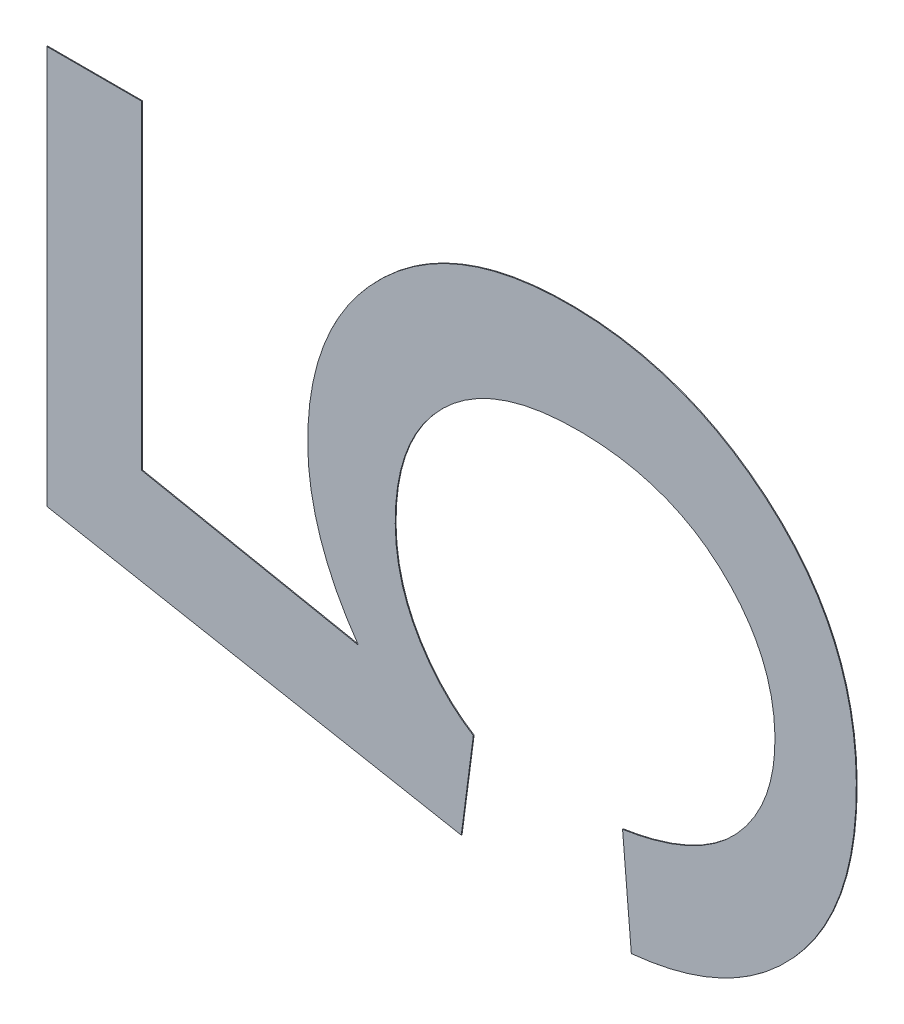
ISO-10303-21;
HEADER;
FILE_DESCRIPTION(('STEP AP214'),'2;1');
FILE_NAME('part.step','',(''),(''),'','','');
FILE_SCHEMA(('AUTOMOTIVE_DESIGN { 1 0 10303 214 1 1 1 1 }'));
ENDSEC;
DATA;
#1=APPLICATION_CONTEXT('core data for automotive mechanical design processes');
#2=APPLICATION_PROTOCOL_DEFINITION('international standard','automotive_design',2000,#1);
#3=PRODUCT_CONTEXT('',#1,'mechanical');
#4=PRODUCT('Part','Part','',(#3));
#5=PRODUCT_RELATED_PRODUCT_CATEGORY('part','',(#4));
#6=PRODUCT_DEFINITION_FORMATION('','',#4);
#7=PRODUCT_DEFINITION_CONTEXT('part definition',#1,'design');
#8=PRODUCT_DEFINITION('design','',#6,#7);
#9=PRODUCT_DEFINITION_SHAPE('','',#8);
#10=(LENGTH_UNIT() NAMED_UNIT(*) SI_UNIT(.MILLI.,.METRE.));
#11=(NAMED_UNIT(*) PLANE_ANGLE_UNIT() SI_UNIT($,.RADIAN.));
#12=(NAMED_UNIT(*) SI_UNIT($,.STERADIAN.) SOLID_ANGLE_UNIT());
#13=UNCERTAINTY_MEASURE_WITH_UNIT(LENGTH_MEASURE(1.E-05),#10,'distance_accuracy_value','');
#14=(GEOMETRIC_REPRESENTATION_CONTEXT(3) GLOBAL_UNCERTAINTY_ASSIGNED_CONTEXT((#13)) GLOBAL_UNIT_ASSIGNED_CONTEXT((#10,
#11,#12)) REPRESENTATION_CONTEXT('',''));
#15=CARTESIAN_POINT('',(0.,0.,0.));
#16=DIRECTION('',(0.,0.,1.));
#17=DIRECTION('',(1.,0.,0.));
#18=AXIS2_PLACEMENT_3D('',#15,#16,#17);
#19=CARTESIAN_POINT('',(63.4544710456313,-9.91477540411022,0.002));
#20=DIRECTION('',(0.996426205082625,0.0844678508347327,0.));
#21=DIRECTION('',(-0.0844678508347327,0.996426205082625,0.));
#22=AXIS2_PLACEMENT_3D('',#19,#20,#21);
#23=PLANE('',#22);
#24=CARTESIAN_POINT('',(63.4544710456313,-9.91477540411022,0.));
#25=CARTESIAN_POINT('',(63.4617011117932,-10.000064982536,0.));
#26=CARTESIAN_POINT('',(63.4689311779551,-10.0853545609618,0.));
#27=CARTESIAN_POINT('',(63.476161244117,-10.1706441393876,0.));
#28=B_SPLINE_CURVE_WITH_KNOTS('',3,(#24,#25,#26,#27),.UNSPECIFIED.,.F.,.F.,(4,4),(0.,
0.0271361239306038),.UNSPECIFIED.);
#29=CARTESIAN_POINT('',(63.4544710456313,-9.91477540411022,0.));
#30=VERTEX_POINT('',#29);
#31=CARTESIAN_POINT('',(63.476161244117,-10.1706441393876,0.));
#32=VERTEX_POINT('',#31);
#33=EDGE_CURVE('E96',#30,#32,#28,.T.);
#34=ORIENTED_EDGE('',*,*,#33,.T.);
#35=DIRECTION('',(0.,0.,-1.));
#36=VECTOR('',#35,1.);
#37=CARTESIAN_POINT('',(63.476161244117,-10.1706441393876,0.002));
#38=LINE('',#37,#36);
#39=CARTESIAN_POINT('',(63.476161244117,-10.1706441393876,0.002));
#40=VERTEX_POINT('',#39);
#41=EDGE_CURVE('E105',#40,#32,#38,.T.);
#42=ORIENTED_EDGE('',*,*,#41,.F.);
#43=CARTESIAN_POINT('',(63.4544710456313,-9.91477540411022,0.002));
#44=CARTESIAN_POINT('',(63.4617011117932,-10.000064982536,0.002));
#45=CARTESIAN_POINT('',(63.4689311779551,-10.0853545609618,0.002));
#46=CARTESIAN_POINT('',(63.476161244117,-10.1706441393876,0.002));
#47=B_SPLINE_CURVE_WITH_KNOTS('',3,(#43,#44,#45,#46),.UNSPECIFIED.,.F.,.F.,(4,4),(0.,
0.0271361239306038),.UNSPECIFIED.);
#48=CARTESIAN_POINT('',(63.4544710456313,-9.91477540411022,0.002));
#49=VERTEX_POINT('',#48);
#50=EDGE_CURVE('E110',#49,#40,#47,.T.);
#51=ORIENTED_EDGE('',*,*,#50,.F.);
#52=DIRECTION('',(0.,0.,-1.));
#53=VECTOR('',#52,1.);
#54=CARTESIAN_POINT('',(63.4544710456313,-9.91477540411022,0.002));
#55=LINE('',#54,#53);
#56=EDGE_CURVE('E102',#49,#30,#55,.T.);
#57=ORIENTED_EDGE('',*,*,#56,.T.);
#58=EDGE_LOOP('',(#34,#42,#51,#57));
#59=FACE_BOUND('',#58,.T.);
#60=ADVANCED_FACE('F17',(#59),#23,.F.);
#61=CARTESIAN_POINT('',(63.476161244117,-10.1706441393876,0.002));
#62=CARTESIAN_POINT('',(63.6443625946388,-10.1543985054017,0.002));
#63=CARTESIAN_POINT('',(63.7794147738899,-10.0890098286086,0.002));
#64=CARTESIAN_POINT('',(63.9832207898506,-9.86075867110722,0.002));
#65=CARTESIAN_POINT('',(64.0339676693268,-9.71332954268548,0.002));
#66=CARTESIAN_POINT('',(64.0339676693268,-9.31246852408422,0.002));
#67=CARTESIAN_POINT('',(63.9533456108042,-9.1390463812851,0.002));
#68=CARTESIAN_POINT('',(63.6589747764427,-8.90740387384396,0.002));
#69=CARTESIAN_POINT('',(63.5031716799673,-8.85434164568279,0.002));
#70=CARTESIAN_POINT('',(63.1319828115408,-8.85434164568279,0.002));
#71=CARTESIAN_POINT('',(62.9764681808881,-8.91404435058085,0.002));
#72=CARTESIAN_POINT('',(62.7341972884979,-9.15203843627509,0.002));
#73=CARTESIAN_POINT('',(62.6740331491713,-9.29865973519624,0.002));
#74=CARTESIAN_POINT('',(62.6740331491713,-9.60285923158159,0.002));
#75=CARTESIAN_POINT('',(62.7157765500307,-9.72795061327275,0.002));
#76=CARTESIAN_POINT('',(62.7996726007776,-9.84694988221923,0.002));
#77=B_SPLINE_CURVE_WITH_KNOTS('',3,(#61,#62,#63,#64,#65,#66,#67,#68,#69,#70,#71,#72,#73,#74,#75,
#76),.UNSPECIFIED.,.F.,.F.,(4,2,2,2,2,2,2,4),(0.0271361239306038,0.0758681975718254,
0.124600271213045,0.184198280193186,0.23285420515581,0.28381661866068,0.334777125474917,
0.373206360121718),.UNSPECIFIED.);
#78=DIRECTION('',(0.,0.,-1.));
#79=VECTOR('',#78,1.);
#80=SURFACE_OF_LINEAR_EXTRUSION('',#77,#79);
#81=CARTESIAN_POINT('',(63.476161244117,-10.1706441393876,0.));
#82=CARTESIAN_POINT('',(63.6443625946388,-10.1543985054017,0.));
#83=CARTESIAN_POINT('',(63.7794147738899,-10.0890098286086,0.));
#84=CARTESIAN_POINT('',(63.9832207898506,-9.86075867110722,0.));
#85=CARTESIAN_POINT('',(64.0339676693268,-9.71332954268548,0.));
#86=CARTESIAN_POINT('',(64.0339676693268,-9.31246852408422,0.));
#87=CARTESIAN_POINT('',(63.9533456108042,-9.1390463812851,0.));
#88=CARTESIAN_POINT('',(63.6589747764427,-8.90740387384396,0.));
#89=CARTESIAN_POINT('',(63.5031716799673,-8.85434164568279,0.));
#90=CARTESIAN_POINT('',(63.1319828115408,-8.85434164568279,0.));
#91=CARTESIAN_POINT('',(62.9764681808881,-8.91404435058085,0.));
#92=CARTESIAN_POINT('',(62.7341972884979,-9.15203843627509,0.));
#93=CARTESIAN_POINT('',(62.6740331491713,-9.29865973519624,0.));
#94=CARTESIAN_POINT('',(62.6740331491713,-9.60285923158159,0.));
#95=CARTESIAN_POINT('',(62.7157765500307,-9.72795061327275,0.));
#96=CARTESIAN_POINT('',(62.7996726007776,-9.84694988221923,0.));
#97=B_SPLINE_CURVE_WITH_KNOTS('',3,(#81,#82,#83,#84,#85,#86,#87,#88,#89,#90,#91,#92,#93,#94,#95,
#96),.UNSPECIFIED.,.F.,.F.,(4,2,2,2,2,2,2,4),(0.0271361239306038,0.0758681975718254,
0.124600271213045,0.184198280193186,0.23285420515581,0.28381661866068,0.334777125474917,
0.373206360121718),.UNSPECIFIED.);
#98=CARTESIAN_POINT('',(62.7996726007776,-9.84694988221923,0.));
#99=VERTEX_POINT('',#98);
#100=EDGE_CURVE('E93',#32,#99,#97,.T.);
#101=ORIENTED_EDGE('',*,*,#100,.T.);
#102=DIRECTION('',(0.,0.,-1.));
#103=VECTOR('',#102,1.);
#104=CARTESIAN_POINT('',(62.7996726007776,-9.84694988221923,0.002));
#105=LINE('',#104,#103);
#106=CARTESIAN_POINT('',(62.7996726007776,-9.84694988221923,0.002));
#107=VERTEX_POINT('',#106);
#108=EDGE_CURVE('E101',#107,#99,#105,.T.);
#109=ORIENTED_EDGE('',*,*,#108,.F.);
#110=EDGE_CURVE('E87',#40,#107,#77,.T.);
#111=ORIENTED_EDGE('',*,*,#110,.F.);
#112=ORIENTED_EDGE('',*,*,#41,.T.);
#113=EDGE_LOOP('',(#101,#109,#111,#112));
#114=FACE_BOUND('',#113,.T.);
#115=ADVANCED_FACE('F106',(#114),#80,.F.);
#116=CARTESIAN_POINT('',(62.7996726007776,-9.84694988221923,0.002));
#117=DIRECTION('',(-0.194825865837274,-0.980837846945537,0.));
#118=DIRECTION('',(0.980837846945537,-0.194825865837274,0.));
#119=AXIS2_PLACEMENT_3D('',#116,#117,#118);
#120=PLANE('',#119);
#121=CARTESIAN_POINT('',(62.7996726007776,-9.84694988221923,0.));
#122=CARTESIAN_POINT('',(62.6204215264989,-9.81134486773354,0.));
#123=CARTESIAN_POINT('',(62.4411704522202,-9.77573985324784,0.));
#124=CARTESIAN_POINT('',(62.2619193779415,-9.74013483876215,0.));
#125=B_SPLINE_CURVE_WITH_KNOTS('',3,(#121,#122,#123,#124),.UNSPECIFIED.,.F.,.F.,(4,4),
(0.373206360121718,0.428480337278279),.UNSPECIFIED.);
#126=CARTESIAN_POINT('',(62.2619193779415,-9.74013483876215,0.));
#127=VERTEX_POINT('',#126);
#128=EDGE_CURVE('E98',#99,#127,#125,.T.);
#129=ORIENTED_EDGE('',*,*,#128,.T.);
#130=DIRECTION('',(0.,0.,-1.));
#131=VECTOR('',#130,1.);
#132=CARTESIAN_POINT('',(62.2619193779415,-9.74013483876215,0.002));
#133=LINE('',#132,#131);
#134=CARTESIAN_POINT('',(62.2619193779415,-9.74013483876215,0.002));
#135=VERTEX_POINT('',#134);
#136=EDGE_CURVE('E353',#135,#127,#133,.T.);
#137=ORIENTED_EDGE('',*,*,#136,.F.);
#138=CARTESIAN_POINT('',(62.7996726007776,-9.84694988221923,0.002));
#139=CARTESIAN_POINT('',(62.6204215264989,-9.81134486773354,0.002));
#140=CARTESIAN_POINT('',(62.4411704522202,-9.77573985324784,0.002));
#141=CARTESIAN_POINT('',(62.2619193779415,-9.74013483876215,0.002));
#142=B_SPLINE_CURVE_WITH_KNOTS('',3,(#138,#139,#140,#141),.UNSPECIFIED.,.F.,.F.,(4,4),
(0.373206360121718,0.428480337278279),.UNSPECIFIED.);
#143=EDGE_CURVE('E346',#107,#135,#142,.T.);
#144=ORIENTED_EDGE('',*,*,#143,.F.);
#145=ORIENTED_EDGE('',*,*,#108,.T.);
#146=EDGE_LOOP('',(#129,#137,#144,#145));
#147=FACE_BOUND('',#146,.T.);
#148=ADVANCED_FACE('F161',(#147),#120,.F.);
#149=CARTESIAN_POINT('',(62.2619193779415,-9.74013483876215,0.002));
#150=DIRECTION('',(-1.,0.,0.));
#151=DIRECTION('',(0.,0.,1.));
#152=AXIS2_PLACEMENT_3D('',#149,#150,#151);
#153=PLANE('',#152);
#154=CARTESIAN_POINT('',(62.2619193779415,-9.74013483876215,0.));
#155=CARTESIAN_POINT('',(62.2619193779415,-9.47600790620861,0.));
#156=CARTESIAN_POINT('',(62.2619193779415,-9.21188097365507,0.));
#157=CARTESIAN_POINT('',(62.2619193779415,-8.94775404110152,0.));
#158=B_SPLINE_CURVE_WITH_KNOTS('',3,(#154,#155,#156,#157),.UNSPECIFIED.,.F.,.F.,(4,4),
(0.428480337278279,0.5083660015048),.UNSPECIFIED.);
#159=CARTESIAN_POINT('',(62.2619193779415,-8.94775404110152,0.));
#160=VERTEX_POINT('',#159);
#161=EDGE_CURVE('E342',#127,#160,#158,.T.);
#162=ORIENTED_EDGE('',*,*,#161,.T.);
#163=DIRECTION('',(0.,0.,-1.));
#164=VECTOR('',#163,1.);
#165=CARTESIAN_POINT('',(62.2619193779415,-8.94775404110152,0.002));
#166=LINE('',#165,#164);
#167=CARTESIAN_POINT('',(62.2619193779415,-8.94775404110152,0.002));
#168=VERTEX_POINT('',#167);
#169=EDGE_CURVE('E337',#168,#160,#166,.T.);
#170=ORIENTED_EDGE('',*,*,#169,.F.);
#171=CARTESIAN_POINT('',(62.2619193779415,-9.74013483876215,0.002));
#172=CARTESIAN_POINT('',(62.2619193779415,-9.47600790620861,0.002));
#173=CARTESIAN_POINT('',(62.2619193779415,-9.21188097365507,0.002));
#174=CARTESIAN_POINT('',(62.2619193779415,-8.94775404110152,0.002));
#175=B_SPLINE_CURVE_WITH_KNOTS('',3,(#171,#172,#173,#174),.UNSPECIFIED.,.F.,.F.,(4,4),
(0.428480337278279,0.5083660015048),.UNSPECIFIED.);
#176=EDGE_CURVE('E330',#135,#168,#175,.T.);
#177=ORIENTED_EDGE('',*,*,#176,.F.);
#178=ORIENTED_EDGE('',*,*,#136,.T.);
#179=EDGE_LOOP('',(#162,#170,#177,#178));
#180=FACE_BOUND('',#179,.T.);
#181=ADVANCED_FACE('F164',(#180),#153,.F.);
#182=CARTESIAN_POINT('',(62.2619193779415,-8.94775404110152,0.002));
#183=DIRECTION('',(0.,-1.,0.));
#184=DIRECTION('',(0.,0.,-1.));
#185=AXIS2_PLACEMENT_3D('',#182,#183,#184);
#186=PLANE('',#185);
#187=CARTESIAN_POINT('',(62.2619193779415,-8.94775404110152,0.));
#188=CARTESIAN_POINT('',(62.1837528135871,-8.94775404110152,0.));
#189=CARTESIAN_POINT('',(62.1055862492327,-8.94775404110152,0.));
#190=CARTESIAN_POINT('',(62.0274196848782,-8.94775404110152,0.));
#191=B_SPLINE_CURVE_WITH_KNOTS('',3,(#187,#188,#189,#190),.UNSPECIFIED.,.F.,.F.,(4,4),
(0.5083660015048,0.532007619011131),.UNSPECIFIED.);
#192=CARTESIAN_POINT('',(62.0274196848782,-8.94775404110152,0.));
#193=VERTEX_POINT('',#192);
#194=EDGE_CURVE('E326',#160,#193,#191,.T.);
#195=ORIENTED_EDGE('',*,*,#194,.T.);
#196=DIRECTION('',(0.,0.,-1.));
#197=VECTOR('',#196,1.);
#198=CARTESIAN_POINT('',(62.0274196848782,-8.94775404110152,0.002));
#199=LINE('',#198,#197);
#200=CARTESIAN_POINT('',(62.0274196848782,-8.94775404110152,0.002));
#201=VERTEX_POINT('',#200);
#202=EDGE_CURVE('E321',#201,#193,#199,.T.);
#203=ORIENTED_EDGE('',*,*,#202,.F.);
#204=CARTESIAN_POINT('',(62.2619193779415,-8.94775404110152,0.002));
#205=CARTESIAN_POINT('',(62.1837528135871,-8.94775404110152,0.002));
#206=CARTESIAN_POINT('',(62.1055862492327,-8.94775404110152,0.002));
#207=CARTESIAN_POINT('',(62.0274196848782,-8.94775404110152,0.002));
#208=B_SPLINE_CURVE_WITH_KNOTS('',3,(#204,#205,#206,#207),.UNSPECIFIED.,.F.,.F.,(4,4),
(0.5083660015048,0.532007619011131),.UNSPECIFIED.);
#209=EDGE_CURVE('E314',#168,#201,#208,.T.);
#210=ORIENTED_EDGE('',*,*,#209,.F.);
#211=ORIENTED_EDGE('',*,*,#169,.T.);
#212=EDGE_LOOP('',(#195,#203,#210,#211));
#213=FACE_BOUND('',#212,.T.);
#214=ADVANCED_FACE('F168',(#213),#186,.F.);
#215=CARTESIAN_POINT('',(62.0274196848782,-8.94775404110152,0.002));
#216=DIRECTION('',(1.,0.,0.));
#217=DIRECTION('',(0.,0.,-1.));
#218=AXIS2_PLACEMENT_3D('',#215,#216,#217);
#219=PLANE('',#218);
#220=CARTESIAN_POINT('',(62.0274196848782,-8.94775404110152,0.));
#221=CARTESIAN_POINT('',(62.0274196848782,-9.27686350959853,0.));
#222=CARTESIAN_POINT('',(62.0274196848782,-9.60597297809554,0.));
#223=CARTESIAN_POINT('',(62.0274196848782,-9.93508244659255,0.));
#224=B_SPLINE_CURVE_WITH_KNOTS('',3,(#220,#221,#222,#223),.UNSPECIFIED.,.F.,.F.,(4,4),
(0.532007619011131,0.63154736772032),.UNSPECIFIED.);
#225=CARTESIAN_POINT('',(62.0274196848782,-9.93508244659255,0.));
#226=VERTEX_POINT('',#225);
#227=EDGE_CURVE('E310',#193,#226,#224,.T.);
#228=ORIENTED_EDGE('',*,*,#227,.T.);
#229=DIRECTION('',(0.,0.,-1.));
#230=VECTOR('',#229,1.);
#231=CARTESIAN_POINT('',(62.0274196848782,-9.93508244659255,0.002));
#232=LINE('',#231,#230);
#233=CARTESIAN_POINT('',(62.0274196848782,-9.93508244659255,0.002));
#234=VERTEX_POINT('',#233);
#235=EDGE_CURVE('E305',#234,#226,#232,.T.);
#236=ORIENTED_EDGE('',*,*,#235,.F.);
#237=CARTESIAN_POINT('',(62.0274196848782,-8.94775404110152,0.002));
#238=CARTESIAN_POINT('',(62.0274196848782,-9.27686350959853,0.002));
#239=CARTESIAN_POINT('',(62.0274196848782,-9.60597297809554,0.002));
#240=CARTESIAN_POINT('',(62.0274196848782,-9.93508244659255,0.002));
#241=B_SPLINE_CURVE_WITH_KNOTS('',3,(#237,#238,#239,#240),.UNSPECIFIED.,.F.,.F.,(4,4),
(0.532007619011131,0.63154736772032),.UNSPECIFIED.);
#242=EDGE_CURVE('E298',#201,#234,#241,.T.);
#243=ORIENTED_EDGE('',*,*,#242,.F.);
#244=ORIENTED_EDGE('',*,*,#202,.T.);
#245=EDGE_LOOP('',(#228,#236,#243,#244));
#246=FACE_BOUND('',#245,.T.);
#247=ADVANCED_FACE('F172',(#246),#219,.F.);
#248=CARTESIAN_POINT('',(62.0274196848782,-9.93508244659255,0.002));
#249=DIRECTION('',(0.183827968542033,0.982958431461732,0.));
#250=DIRECTION('',(-0.982958431461732,0.183827968542033,0.));
#251=AXIS2_PLACEMENT_3D('',#248,#249,#250);
#252=PLANE('',#251);
#253=CARTESIAN_POINT('',(62.0274196848782,-9.93508244659255,0.));
#254=CARTESIAN_POINT('',(62.3698247049997,-9.99911732055351,0.));
#255=CARTESIAN_POINT('',(62.7122297251211,-10.0631521945145,0.));
#256=CARTESIAN_POINT('',(63.0546347452425,-10.1271870684754,0.));
#257=B_SPLINE_CURVE_WITH_KNOTS('',3,(#253,#254,#255,#256),.UNSPECIFIED.,.F.,.F.,(4,4),
(0.63154736772032,0.736903819037877),.UNSPECIFIED.);
#258=CARTESIAN_POINT('',(63.0546347452425,-10.1271870684754,0.));
#259=VERTEX_POINT('',#258);
#260=EDGE_CURVE('E294',#226,#259,#257,.T.);
#261=ORIENTED_EDGE('',*,*,#260,.T.);
#262=DIRECTION('',(0.,0.,-1.));
#263=VECTOR('',#262,1.);
#264=CARTESIAN_POINT('',(63.0546347452425,-10.1271870684754,0.002));
#265=LINE('',#264,#263);
#266=CARTESIAN_POINT('',(63.0546347452425,-10.1271870684754,0.002));
#267=VERTEX_POINT('',#266);
#268=EDGE_CURVE('E289',#267,#259,#265,.T.);
#269=ORIENTED_EDGE('',*,*,#268,.F.);
#270=CARTESIAN_POINT('',(62.0274196848782,-9.93508244659255,0.002));
#271=CARTESIAN_POINT('',(62.3698247049997,-9.99911732055351,0.002));
#272=CARTESIAN_POINT('',(62.7122297251211,-10.0631521945145,0.002));
#273=CARTESIAN_POINT('',(63.0546347452425,-10.1271870684754,0.002));
#274=B_SPLINE_CURVE_WITH_KNOTS('',3,(#270,#271,#272,#273),.UNSPECIFIED.,.F.,.F.,(4,4),
(0.63154736772032,0.736903819037877),.UNSPECIFIED.);
#275=EDGE_CURVE('E282',#234,#267,#274,.T.);
#276=ORIENTED_EDGE('',*,*,#275,.F.);
#277=ORIENTED_EDGE('',*,*,#235,.T.);
#278=EDGE_LOOP('',(#261,#269,#276,#277));
#279=FACE_BOUND('',#278,.T.);
#280=ADVANCED_FACE('F176',(#279),#252,.F.);
#281=CARTESIAN_POINT('',(63.0546347452425,-10.1271870684754,0.002));
#282=DIRECTION('',(-0.991572404905229,0.129553717933758,0.));
#283=DIRECTION('',(-0.129553717933758,-0.99157240490523,0.));
#284=AXIS2_PLACEMENT_3D('',#281,#282,#283);
#285=PLANE('',#284);
#286=CARTESIAN_POINT('',(63.0546347452425,-10.1271870684754,0.));
#287=CARTESIAN_POINT('',(63.064593138258,-10.0509679690251,0.));
#288=CARTESIAN_POINT('',(63.0745515312734,-9.97474886957471,0.));
#289=CARTESIAN_POINT('',(63.0845099242889,-9.89852977012435,0.));
#290=B_SPLINE_CURVE_WITH_KNOTS('',3,(#286,#287,#288,#289),.UNSPECIFIED.,.F.,.F.,(4,4),
(0.736903819037877,0.760152351513067),.UNSPECIFIED.);
#291=CARTESIAN_POINT('',(63.0845099242889,-9.89852977012435,0.));
#292=VERTEX_POINT('',#291);
#293=EDGE_CURVE('E278',#259,#292,#290,.T.);
#294=ORIENTED_EDGE('',*,*,#293,.T.);
#295=DIRECTION('',(0.,0.,-1.));
#296=VECTOR('',#295,1.);
#297=CARTESIAN_POINT('',(63.0845099242889,-9.89852977012435,0.002));
#298=LINE('',#297,#296);
#299=CARTESIAN_POINT('',(63.0845099242889,-9.89852977012435,0.002));
#300=VERTEX_POINT('',#299);
#301=EDGE_CURVE('E273',#300,#292,#298,.T.);
#302=ORIENTED_EDGE('',*,*,#301,.F.);
#303=CARTESIAN_POINT('',(63.0546347452425,-10.1271870684754,0.002));
#304=CARTESIAN_POINT('',(63.064593138258,-10.0509679690251,0.002));
#305=CARTESIAN_POINT('',(63.0745515312734,-9.97474886957471,0.002));
#306=CARTESIAN_POINT('',(63.0845099242889,-9.89852977012435,0.002));
#307=B_SPLINE_CURVE_WITH_KNOTS('',3,(#303,#304,#305,#306),.UNSPECIFIED.,.F.,.F.,(4,4),
(0.736903819037877,0.760152351513067),.UNSPECIFIED.);
#308=EDGE_CURVE('E38',#267,#300,#307,.T.);
#309=ORIENTED_EDGE('',*,*,#308,.F.);
#310=ORIENTED_EDGE('',*,*,#268,.T.);
#311=EDGE_LOOP('',(#294,#302,#309,#310));
#312=FACE_BOUND('',#311,.T.);
#313=ADVANCED_FACE('F180',(#312),#285,.F.);
#314=CARTESIAN_POINT('',(63.0845099242889,-9.89852977012435,0.002));
#315=CARTESIAN_POINT('',(63.0272150603642,-9.8623832345058,0.002));
#316=CARTESIAN_POINT('',(62.9805606711684,-9.81242790999926,0.002));
#317=CARTESIAN_POINT('',(62.9090780366763,-9.68604102445482,0.002));
#318=CARTESIAN_POINT('',(62.8909351340291,-9.61544959792063,0.002));
#319=CARTESIAN_POINT('',(62.8909351340291,-9.41034846884907,0.002));
#320=CARTESIAN_POINT('',(62.9314507878044,-9.30840711558776,0.002));
#321=CARTESIAN_POINT('',(63.0935049109795,-9.15245720137817,0.002));
#322=CARTESIAN_POINT('',(63.2036013914467,-9.11305336690772,0.002));
#323=CARTESIAN_POINT('',(63.4913034581543,-9.11305336690772,0.002));
#324=CARTESIAN_POINT('',(63.609576427256,-9.15366745187238,0.002));
#325=CARTESIAN_POINT('',(63.7874135682513,-9.31632781818598,0.002));
#326=CARTESIAN_POINT('',(63.8322078985062,-9.41562829989448,0.002));
#327=CARTESIAN_POINT('',(63.8322078985062,-9.63047680935756,0.002));
#328=CARTESIAN_POINT('',(63.8006957233477,-9.71373568353512,0.002));
#329=CARTESIAN_POINT('',(63.6740155200964,-9.85162003828092,0.002));
#330=CARTESIAN_POINT('',(63.5797012482095,-9.89568678417683,0.002));
#331=CARTESIAN_POINT('',(63.4544710456313,-9.91477540411022,0.002));
#332=B_SPLINE_CURVE_WITH_KNOTS('',3,(#314,#315,#316,#317,#318,#319,#320,#321,#322,#323,#324,
#325,#326,#327,#328,#329,#330,#331),.UNSPECIFIED.,.F.,.F.,(4,2,2,2,2,2,2,2,4),
(0.760152351513067,0.780952247048673,0.801911803868986,0.835794610749493,0.869673866776577,
0.905232269603837,0.940879986949426,0.970483627651645,1.),.UNSPECIFIED.);
#333=DIRECTION('',(0.,0.,-1.));
#334=VECTOR('',#333,1.);
#335=SURFACE_OF_LINEAR_EXTRUSION('',#332,#334);
#336=CARTESIAN_POINT('',(63.0845099242889,-9.89852977012435,0.));
#337=CARTESIAN_POINT('',(63.0272150603642,-9.8623832345058,0.));
#338=CARTESIAN_POINT('',(62.9805606711684,-9.81242790999926,0.));
#339=CARTESIAN_POINT('',(62.9090780366763,-9.68604102445482,0.));
#340=CARTESIAN_POINT('',(62.8909351340291,-9.61544959792063,0.));
#341=CARTESIAN_POINT('',(62.8909351340291,-9.41034846884907,0.));
#342=CARTESIAN_POINT('',(62.9314507878044,-9.30840711558776,0.));
#343=CARTESIAN_POINT('',(63.0935049109795,-9.15245720137817,0.));
#344=CARTESIAN_POINT('',(63.2036013914467,-9.11305336690772,0.));
#345=CARTESIAN_POINT('',(63.4913034581543,-9.11305336690772,0.));
#346=CARTESIAN_POINT('',(63.609576427256,-9.15366745187238,0.));
#347=CARTESIAN_POINT('',(63.7874135682513,-9.31632781818598,0.));
#348=CARTESIAN_POINT('',(63.8322078985062,-9.41562829989448,0.));
#349=CARTESIAN_POINT('',(63.8322078985062,-9.63047680935756,0.));
#350=CARTESIAN_POINT('',(63.8006957233477,-9.71373568353512,0.));
#351=CARTESIAN_POINT('',(63.6740155200964,-9.85162003828092,0.));
#352=CARTESIAN_POINT('',(63.5797012482095,-9.89568678417683,0.));
#353=CARTESIAN_POINT('',(63.4544710456313,-9.91477540411022,0.));
#354=B_SPLINE_CURVE_WITH_KNOTS('',3,(#336,#337,#338,#339,#340,#341,#342,#343,#344,#345,#346,
#347,#348,#349,#350,#351,#352,#353),.UNSPECIFIED.,.F.,.F.,(4,2,2,2,2,2,2,2,4),
(0.760152351513067,0.780952247048673,0.801911803868986,0.835794610749493,0.869673866776577,
0.905232269603837,0.940879986949426,0.970483627651645,1.),.UNSPECIFIED.);
#355=EDGE_CURVE('E30',#292,#30,#354,.T.);
#356=ORIENTED_EDGE('',*,*,#355,.T.);
#357=ORIENTED_EDGE('',*,*,#56,.F.);
#358=EDGE_CURVE('E11',#300,#49,#332,.T.);
#359=ORIENTED_EDGE('',*,*,#358,.F.);
#360=ORIENTED_EDGE('',*,*,#301,.T.);
#361=EDGE_LOOP('',(#356,#357,#359,#360));
#362=FACE_BOUND('',#361,.T.);
#363=ADVANCED_FACE('F184',(#362),#335,.F.);
#364=CARTESIAN_POINT('',(63.6533120885623,-8.92555781285915,0.002));
#365=DIRECTION('',(0.,0.,-1.));
#366=DIRECTION('',(-1.,0.,0.));
#367=AXIS2_PLACEMENT_3D('',#364,#365,#366);
#368=PLANE('',#367);
#369=ORIENTED_EDGE('',*,*,#50,.T.);
#370=ORIENTED_EDGE('',*,*,#110,.T.);
#371=ORIENTED_EDGE('',*,*,#143,.T.);
#372=ORIENTED_EDGE('',*,*,#176,.T.);
#373=ORIENTED_EDGE('',*,*,#209,.T.);
#374=ORIENTED_EDGE('',*,*,#242,.T.);
#375=ORIENTED_EDGE('',*,*,#275,.T.);
#376=ORIENTED_EDGE('',*,*,#308,.T.);
#377=ORIENTED_EDGE('',*,*,#358,.T.);
#378=EDGE_LOOP('',(#369,#370,#371,#372,#373,#374,#375,#376,#377));
#379=FACE_BOUND('',#378,.T.);
#380=ADVANCED_FACE('F187',(#379),#368,.F.);
#381=CARTESIAN_POINT('',(63.6533120885623,-8.92555781285915,0.));
#382=DIRECTION('',(0.,0.,-1.));
#383=DIRECTION('',(-1.,0.,0.));
#384=AXIS2_PLACEMENT_3D('',#381,#382,#383);
#385=PLANE('',#384);
#386=ORIENTED_EDGE('',*,*,#33,.F.);
#387=ORIENTED_EDGE('',*,*,#355,.F.);
#388=ORIENTED_EDGE('',*,*,#293,.F.);
#389=ORIENTED_EDGE('',*,*,#260,.F.);
#390=ORIENTED_EDGE('',*,*,#227,.F.);
#391=ORIENTED_EDGE('',*,*,#194,.F.);
#392=ORIENTED_EDGE('',*,*,#161,.F.);
#393=ORIENTED_EDGE('',*,*,#128,.F.);
#394=ORIENTED_EDGE('',*,*,#100,.F.);
#395=EDGE_LOOP('',(#386,#387,#388,#389,#390,#391,#392,#393,#394));
#396=FACE_BOUND('',#395,.T.);
#397=ADVANCED_FACE('F19',(#396),#385,.T.);
#398=CLOSED_SHELL('',(#60,#115,#148,#181,#214,#247,#280,#313,#363,#380,#397));
#399=MANIFOLD_SOLID_BREP('B1',#398);
#400=ADVANCED_BREP_SHAPE_REPRESENTATION('',(#18,#399),#14);
#401=SHAPE_DEFINITION_REPRESENTATION(#9,#400);
ENDSEC;
END-ISO-10303-21;
